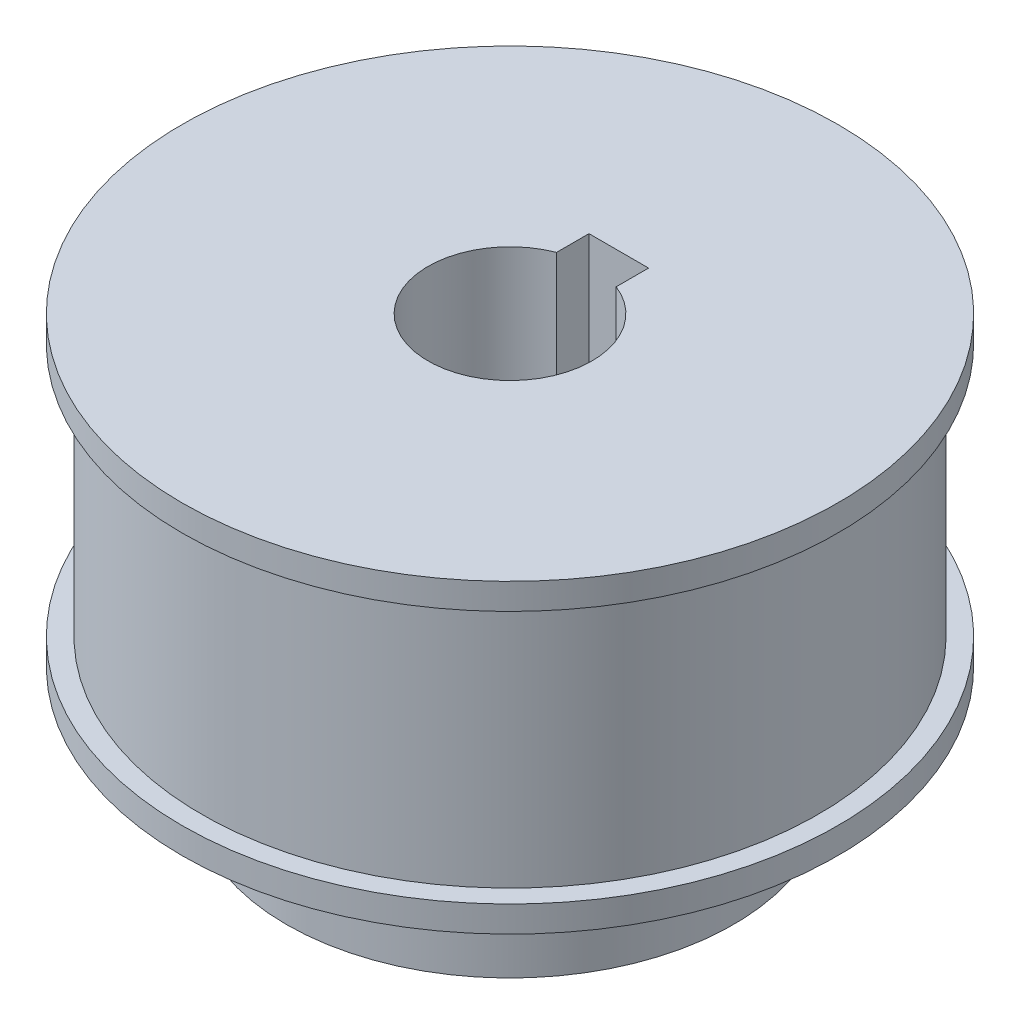
ISO-10303-21;
HEADER;
FILE_DESCRIPTION(('STEP AP214'),'2;1');
FILE_NAME('part.step','',(''),(''),'','','');
FILE_SCHEMA(('AUTOMOTIVE_DESIGN { 1 0 10303 214 1 1 1 1 }'));
ENDSEC;
DATA;
#1=APPLICATION_CONTEXT('core data for automotive mechanical design processes');
#2=APPLICATION_PROTOCOL_DEFINITION('international standard','automotive_design',2000,#1);
#3=PRODUCT_CONTEXT('',#1,'mechanical');
#4=PRODUCT('Part','Part','',(#3));
#5=PRODUCT_RELATED_PRODUCT_CATEGORY('part','',(#4));
#6=PRODUCT_DEFINITION_FORMATION('','',#4);
#7=PRODUCT_DEFINITION_CONTEXT('part definition',#1,'design');
#8=PRODUCT_DEFINITION('design','',#6,#7);
#9=PRODUCT_DEFINITION_SHAPE('','',#8);
#10=(LENGTH_UNIT() NAMED_UNIT(*) SI_UNIT(.MILLI.,.METRE.));
#11=(NAMED_UNIT(*) PLANE_ANGLE_UNIT() SI_UNIT($,.RADIAN.));
#12=(NAMED_UNIT(*) SI_UNIT($,.STERADIAN.) SOLID_ANGLE_UNIT());
#13=UNCERTAINTY_MEASURE_WITH_UNIT(LENGTH_MEASURE(1.E-05),#10,'distance_accuracy_value','');
#14=(GEOMETRIC_REPRESENTATION_CONTEXT(3) GLOBAL_UNCERTAINTY_ASSIGNED_CONTEXT((#13)) GLOBAL_UNIT_ASSIGNED_CONTEXT((#10,
#11,#12)) REPRESENTATION_CONTEXT('',''));
#15=CARTESIAN_POINT('',(0.,0.,0.));
#16=DIRECTION('',(0.,0.,1.));
#17=DIRECTION('',(1.,0.,0.));
#18=AXIS2_PLACEMENT_3D('',#15,#16,#17);
#19=CARTESIAN_POINT('',(4.,0.,0.));
#20=DIRECTION('',(0.,-1.,0.));
#21=DIRECTION('',(0.,0.,-1.));
#22=AXIS2_PLACEMENT_3D('',#19,#20,#21);
#23=PLANE('',#22);
#24=CARTESIAN_POINT('',(0.,0.,0.));
#25=DIRECTION('',(0.,-1.,0.));
#26=DIRECTION('',(0.,0.,-1.));
#27=AXIS2_PLACEMENT_3D('',#24,#25,#26);
#28=CIRCLE('',#27,15.);
#29=CARTESIAN_POINT('',(0.,0.,-15.));
#30=VERTEX_POINT('',#29);
#31=EDGE_CURVE('E83',#30,#30,#28,.T.);
#32=ORIENTED_EDGE('',*,*,#31,.T.);
#33=EDGE_LOOP('',(#32));
#34=FACE_BOUND('',#33,.T.);
#35=DIRECTION('',(-1.,0.,0.));
#36=VECTOR('',#35,1.);
#37=CARTESIAN_POINT('',(4.,0.,-7.3));
#38=LINE('',#37,#36);
#39=CARTESIAN_POINT('',(2.,0.,-7.3));
#40=VERTEX_POINT('',#39);
#41=CARTESIAN_POINT('',(-2.,0.,-7.3));
#42=VERTEX_POINT('',#41);
#43=EDGE_CURVE('E95',#40,#42,#38,.T.);
#44=ORIENTED_EDGE('',*,*,#43,.T.);
#45=DIRECTION('',(0.,0.,1.));
#46=VECTOR('',#45,1.);
#47=CARTESIAN_POINT('',(-2.,0.,0.));
#48=LINE('',#47,#46);
#49=CARTESIAN_POINT('',(-2.,0.,-5.1234753829798));
#50=VERTEX_POINT('',#49);
#51=EDGE_CURVE('E100',#42,#50,#48,.T.);
#52=ORIENTED_EDGE('',*,*,#51,.T.);
#53=CARTESIAN_POINT('',(0.,0.,0.));
#54=DIRECTION('',(0.,-1.,0.));
#55=DIRECTION('',(0.,0.,-1.));
#56=AXIS2_PLACEMENT_3D('',#53,#54,#55);
#57=CIRCLE('',#56,5.5);
#58=CARTESIAN_POINT('',(2.,0.,-5.1234753829798));
#59=VERTEX_POINT('',#58);
#60=EDGE_CURVE('E94',#59,#50,#57,.T.);
#61=ORIENTED_EDGE('',*,*,#60,.F.);
#62=DIRECTION('',(0.,0.,1.));
#63=VECTOR('',#62,1.);
#64=CARTESIAN_POINT('',(2.,0.,0.));
#65=LINE('',#64,#63);
#66=EDGE_CURVE('E52',#40,#59,#65,.T.);
#67=ORIENTED_EDGE('',*,*,#66,.F.);
#68=EDGE_LOOP('',(#44,#52,#61,#67));
#69=FACE_BOUND('',#68,.T.);
#70=ADVANCED_FACE('F38',(#34,#69),#23,.T.);
#71=CARTESIAN_POINT('',(22.,28.,0.));
#72=DIRECTION('',(0.,1.,0.));
#73=DIRECTION('',(0.,0.,1.));
#74=AXIS2_PLACEMENT_3D('',#71,#72,#73);
#75=PLANE('',#74);
#76=CARTESIAN_POINT('',(0.,28.,0.));
#77=DIRECTION('',(0.,-1.,0.));
#78=DIRECTION('',(0.,0.,-1.));
#79=AXIS2_PLACEMENT_3D('',#76,#77,#78);
#80=CIRCLE('',#79,22.);
#81=CARTESIAN_POINT('',(0.,28.,-22.));
#82=VERTEX_POINT('',#81);
#83=EDGE_CURVE('E97',#82,#82,#80,.T.);
#84=ORIENTED_EDGE('',*,*,#83,.F.);
#85=EDGE_LOOP('',(#84));
#86=FACE_BOUND('',#85,.T.);
#87=CARTESIAN_POINT('',(0.,28.,0.));
#88=DIRECTION('',(0.,1.,0.));
#89=DIRECTION('',(0.,0.,1.));
#90=AXIS2_PLACEMENT_3D('',#87,#88,#89);
#91=CIRCLE('',#90,5.5);
#92=CARTESIAN_POINT('',(-2.,28.,-5.1234753829798));
#93=VERTEX_POINT('',#92);
#94=CARTESIAN_POINT('',(2.,28.,-5.1234753829798));
#95=VERTEX_POINT('',#94);
#96=EDGE_CURVE('E88',#93,#95,#91,.T.);
#97=ORIENTED_EDGE('',*,*,#96,.F.);
#98=DIRECTION('',(0.,0.,-1.));
#99=VECTOR('',#98,1.);
#100=CARTESIAN_POINT('',(-2.,28.,0.));
#101=LINE('',#100,#99);
#102=CARTESIAN_POINT('',(-2.,28.,-7.3));
#103=VERTEX_POINT('',#102);
#104=EDGE_CURVE('E282',#93,#103,#101,.T.);
#105=ORIENTED_EDGE('',*,*,#104,.T.);
#106=DIRECTION('',(1.,0.,0.));
#107=VECTOR('',#106,1.);
#108=CARTESIAN_POINT('',(0.,28.,-7.3));
#109=LINE('',#108,#107);
#110=CARTESIAN_POINT('',(2.,28.,-7.3));
#111=VERTEX_POINT('',#110);
#112=EDGE_CURVE('E90',#103,#111,#109,.T.);
#113=ORIENTED_EDGE('',*,*,#112,.T.);
#114=DIRECTION('',(0.,0.,-1.));
#115=VECTOR('',#114,1.);
#116=CARTESIAN_POINT('',(2.,28.,0.));
#117=LINE('',#116,#115);
#118=EDGE_CURVE('E77',#95,#111,#117,.T.);
#119=ORIENTED_EDGE('',*,*,#118,.F.);
#120=EDGE_LOOP('',(#97,#105,#113,#119));
#121=FACE_BOUND('',#120,.T.);
#122=ADVANCED_FACE('F86',(#86,#121),#75,.T.);
#123=CARTESIAN_POINT('',(0.,-5.00000000000002,0.));
#124=DIRECTION('',(0.,1.,0.));
#125=DIRECTION('',(0.,0.,1.));
#126=AXIS2_PLACEMENT_3D('',#123,#124,#125);
#127=CYLINDRICAL_SURFACE('',#126,5.5);
#128=DIRECTION('',(0.,1.,0.));
#129=VECTOR('',#128,1.);
#130=CARTESIAN_POINT('',(-2.,-5.00000000000002,-5.1234753829798));
#131=LINE('',#130,#129);
#132=EDGE_CURVE('E11',#93,#50,#131,.F.);
#133=ORIENTED_EDGE('',*,*,#132,.F.);
#134=ORIENTED_EDGE('',*,*,#96,.T.);
#135=DIRECTION('',(0.,1.,0.));
#136=VECTOR('',#135,1.);
#137=CARTESIAN_POINT('',(2.,-5.00000000000002,-5.1234753829798));
#138=LINE('',#137,#136);
#139=EDGE_CURVE('E45',#95,#59,#138,.F.);
#140=ORIENTED_EDGE('',*,*,#139,.T.);
#141=ORIENTED_EDGE('',*,*,#60,.T.);
#142=EDGE_LOOP('',(#133,#134,#140,#141));
#143=FACE_BOUND('',#142,.T.);
#144=ADVANCED_FACE('F93',(#143),#127,.F.);
#145=CARTESIAN_POINT('',(0.,0.,0.));
#146=DIRECTION('',(0.,-1.,0.));
#147=DIRECTION('',(0.,0.,-1.));
#148=AXIS2_PLACEMENT_3D('',#145,#146,#147);
#149=CYLINDRICAL_SURFACE('',#148,15.);
#150=CARTESIAN_POINT('',(0.,4.95,-15.));
#151=CARTESIAN_POINT('',(0.0672891007203543,4.94999705685258,-14.9999993694438));
#152=CARTESIAN_POINT('',(0.134624243596096,4.94432118674519,-14.9995423880637));
#153=CARTESIAN_POINT('',(0.267432174227966,4.92176221280459,-14.9977633353839));
#154=CARTESIAN_POINT('',(0.33290275312361,4.9048663497256,-14.9964402792185));
#155=CARTESIAN_POINT('',(0.460038816008155,4.86035851139508,-14.9930786176967));
#156=CARTESIAN_POINT('',(0.521706404677639,4.83275252623814,-14.991040412379));
#157=CARTESIAN_POINT('',(0.639517540832527,4.76761861911196,-14.9864771457227));
#158=CARTESIAN_POINT('',(0.695662281232538,4.73009284626529,-14.9839521898708));
#159=CARTESIAN_POINT('',(0.800981520437516,4.64608874132847,-14.9786921754651));
#160=CARTESIAN_POINT('',(0.850141193081525,4.59959184630141,-14.975956688463));
#161=CARTESIAN_POINT('',(0.939967680796123,4.49900448163196,-14.9705875232698));
#162=CARTESIAN_POINT('',(0.980634126131958,4.44491368157624,-14.9679538495151));
#163=CARTESIAN_POINT('',(1.0523693929339,4.33058492650224,-14.9630818276391));
#164=CARTESIAN_POINT('',(1.08342527744728,4.27033882949488,-14.9608440141124));
#165=CARTESIAN_POINT('',(1.13497520543789,4.14546644322448,-14.9570218740643));
#166=CARTESIAN_POINT('',(1.15546942232374,4.08084022589693,-14.9554375368137));
#167=CARTESIAN_POINT('',(1.18527149435678,3.94918994518706,-14.9531052553678));
#168=CARTESIAN_POINT('',(1.19460338904055,3.8821713560664,-14.9523555140024));
#169=CARTESIAN_POINT('',(1.20189017441675,3.74751519031609,-14.9517716026433));
#170=CARTESIAN_POINT('',(1.1998452634274,3.67987762449684,-14.9519374166897));
#171=CARTESIAN_POINT('',(1.18445636506824,3.54606805983348,-14.9531642509417));
#172=CARTESIAN_POINT('',(1.17113848317612,3.47989303709295,-14.9542232028355));
#173=CARTESIAN_POINT('',(1.1336222347798,3.3507206521944,-14.9571137455448));
#174=CARTESIAN_POINT('',(1.10942376932552,3.28772331894068,-14.9589453433869));
#175=CARTESIAN_POINT('',(1.05080395723979,3.16661125869635,-14.9631771775933));
#176=CARTESIAN_POINT('',(1.01637087499178,3.10850223560745,-14.9655780660973));
#177=CARTESIAN_POINT('',(0.938267724972068,2.99887866947173,-14.9706773434807));
#178=CARTESIAN_POINT('',(0.894597485014082,2.9473642493811,-14.9733757379054));
#179=CARTESIAN_POINT('',(0.799113129570554,2.85224038797683,-14.9787751755321));
#180=CARTESIAN_POINT('',(0.7472764413159,2.80865360097,-14.9814762048176));
#181=CARTESIAN_POINT('',(0.637009460522138,2.73079735807935,-14.986569319442));
#182=CARTESIAN_POINT('',(0.578579164017653,2.69652790779899,-14.9889614045952));
#183=CARTESIAN_POINT('',(0.456769038505561,2.63828062271137,-14.9931675074541));
#184=CARTESIAN_POINT('',(0.393388740146218,2.61430376523595,-14.9949814702602));
#185=CARTESIAN_POINT('',(0.263484391245863,2.57733801099053,-14.9978262957681));
#186=CARTESIAN_POINT('',(0.196960400856805,2.56434890406879,-14.9988571734474));
#187=CARTESIAN_POINT('',(0.0628534372155328,2.54975570763277,-15.0000177522765));
#188=CARTESIAN_POINT('',(-0.00472610987194925,2.54812032124009,-15.0001499306977));
#189=CARTESIAN_POINT('',(-0.139198438973656,2.55619903972627,-14.9995048293867));
#190=CARTESIAN_POINT('',(-0.206091226879593,2.56591304715636,-14.9987275574634));
#191=CARTESIAN_POINT('',(-0.337202151642211,2.59638887305364,-14.9963525775414));
#192=CARTESIAN_POINT('',(-0.401423675438523,2.61713621133802,-14.9947559449705));
#193=CARTESIAN_POINT('',(-0.525473906573665,2.6690749838152,-14.9909216507345));
#194=CARTESIAN_POINT('',(-0.585302549731882,2.70026657056294,-14.9886839797061));
#195=CARTESIAN_POINT('',(-0.699011291408514,2.77228725783212,-14.9838123793492));
#196=CARTESIAN_POINT('',(-0.752878201550636,2.8131371222896,-14.9811776007826));
#197=CARTESIAN_POINT('',(-0.853001330235448,2.90328475231336,-14.9758107480535));
#198=CARTESIAN_POINT('',(-0.899257426880185,2.9525826531611,-14.9730786723334));
#199=CARTESIAN_POINT('',(-0.982953003347502,3.05836264017617,-14.9678178394568));
#200=CARTESIAN_POINT('',(-1.02037208125379,3.11486089593671,-14.9652895614929));
#201=CARTESIAN_POINT('',(-1.08519160268471,3.23335719203235,-14.9607292445234));
#202=CARTESIAN_POINT('',(-1.11259213949028,3.29535518115369,-14.9586972008976));
#203=CARTESIAN_POINT('',(-1.15656192078193,3.42301840100141,-14.9553620329034));
#204=CARTESIAN_POINT('',(-1.17314371718104,3.48867928563687,-14.9540580640764));
#205=CARTESIAN_POINT('',(-1.19504621125548,3.62186408923241,-14.9523238045272));
#206=CARTESIAN_POINT('',(-1.20036710634437,3.6893879755114,-14.951893498489));
#207=CARTESIAN_POINT('',(-1.19959455280222,3.8241792644683,-14.9519554851438));
#208=CARTESIAN_POINT('',(-1.19353316257195,3.89144685440732,-14.9524451866218));
#209=CARTESIAN_POINT('',(-1.17023487953944,4.02400548111762,-14.9542865079255));
#210=CARTESIAN_POINT('',(-1.1529979690259,4.08929651475622,-14.9556381291172));
#211=CARTESIAN_POINT('',(-1.10784591484578,4.21605119447078,-14.9590503187523));
#212=CARTESIAN_POINT('',(-1.07993127772688,4.27751502194728,-14.9611108535646));
#213=CARTESIAN_POINT('',(-1.01421985060576,4.39488894073033,-14.965708741226));
#214=CARTESIAN_POINT('',(-0.976423233666111,4.4507991292738,-14.9682460857245));
#215=CARTESIAN_POINT('',(-0.891900433865262,4.55564260767561,-14.9735201724507));
#216=CARTESIAN_POINT('',(-0.845150572179066,4.6045567819845,-14.9762574312458));
#217=CARTESIAN_POINT('',(-0.744090092187472,4.69386311077237,-14.9816182295575));
#218=CARTESIAN_POINT('',(-0.689777643659899,4.73425319636566,-14.9842417413439));
#219=CARTESIAN_POINT('',(-0.575036864240477,4.80541449248027,-14.9890838042582));
#220=CARTESIAN_POINT('',(-0.514598012297869,4.83616877165865,-14.9913016397474));
#221=CARTESIAN_POINT('',(-0.389438355842893,4.88705372338789,-14.9950739045471));
#222=CARTESIAN_POINT('',(-0.32472258759087,4.9071966489906,-14.9966290986186));
#223=CARTESIAN_POINT('',(-0.216352037072058,4.93113817847706,-14.9985001170339));
#224=CARTESIAN_POINT('',(-0.173394876677112,4.93820200627376,-14.9990600235622));
#225=CARTESIAN_POINT('',(-0.086964888269531,4.94763386251458,-14.9998101683779));
#226=CARTESIAN_POINT('',(-0.0434920615017642,4.95000190229245,-15.0000004075577));
#227=CARTESIAN_POINT('',(0.,4.95,-15.));
#228=B_SPLINE_CURVE_WITH_KNOTS('',3,(#150,#151,#152,#153,#154,#155,#156,#157,#158,#159,#160,
#161,#162,#163,#164,#165,#166,#167,#168,#169,#170,#171,#172,#173,#174,#175,#176,#177,#178,#179,
#180,#181,#182,#183,#184,#185,#186,#187,#188,#189,#190,#191,#192,#193,#194,#195,#196,#197,#198,
#199,#200,#201,#202,#203,#204,#205,#206,#207,#208,#209,#210,#211,#212,#213,#214,#215,#216,#217,
#218,#219,#220,#221,#222,#223,#224,#225,#226,#227),.UNSPECIFIED.,.T.,.F.,(4,2,2,2,2,2,2,2,2,2,2,
2,2,2,2,2,2,2,2,2,2,2,2,2,2,2,2,2,2,2,2,2,2,2,2,2,2,2,4),(0.,0.201708512546654,
0.403646799378615,0.605472306014581,0.807254122928382,1.00945803099925,1.21167073975718,
1.41415447846014,1.61663489254172,1.818678448603,2.02071848269199,2.22229191686996,
2.42386718423204,2.62567448729818,2.82748555250769,3.02986455775774,3.2322436847186,
3.43464202431565,3.63703649275422,3.83887283233491,4.04070743891062,4.24227780838161,
4.44385112223875,4.64586179522762,4.8478757033885,5.05035153629311,5.25282548393171,
5.45506410139434,5.65729917340559,5.85896550105527,6.06063214831276,6.2622892297599,
6.46394277983446,6.66613720181649,6.8683806422092,7.0709774826502,7.27333986655259,
7.40371373264851,7.53408728407353),.UNSPECIFIED.);
#229=CARTESIAN_POINT('',(0.,4.95,-15.));
#230=VERTEX_POINT('',#229);
#231=EDGE_CURVE('E91',#230,#230,#228,.T.);
#232=ORIENTED_EDGE('',*,*,#231,.F.);
#233=EDGE_LOOP('',(#232));
#234=FACE_BOUND('',#233,.T.);
#235=CARTESIAN_POINT('',(0.,7.5,0.));
#236=DIRECTION('',(0.,-1.,0.));
#237=DIRECTION('',(0.,0.,-1.));
#238=AXIS2_PLACEMENT_3D('',#235,#236,#237);
#239=CIRCLE('',#238,15.);
#240=CARTESIAN_POINT('',(0.,7.5,-15.));
#241=VERTEX_POINT('',#240);
#242=EDGE_CURVE('E121',#241,#241,#239,.T.);
#243=ORIENTED_EDGE('',*,*,#242,.T.);
#244=EDGE_LOOP('',(#243));
#245=FACE_BOUND('',#244,.T.);
#246=ORIENTED_EDGE('',*,*,#31,.F.);
#247=EDGE_LOOP('',(#246));
#248=FACE_BOUND('',#247,.T.);
#249=ADVANCED_FACE('F129',(#234,#245,#248),#149,.T.);
#250=CARTESIAN_POINT('',(15.,7.5,0.));
#251=DIRECTION('',(0.,-1.,0.));
#252=DIRECTION('',(0.,0.,-1.));
#253=AXIS2_PLACEMENT_3D('',#250,#251,#252);
#254=PLANE('',#253);
#255=CARTESIAN_POINT('',(0.,7.5,0.));
#256=DIRECTION('',(0.,-1.,0.));
#257=DIRECTION('',(0.,0.,-1.));
#258=AXIS2_PLACEMENT_3D('',#255,#256,#257);
#259=CIRCLE('',#258,22.);
#260=CARTESIAN_POINT('',(0.,7.5,-22.));
#261=VERTEX_POINT('',#260);
#262=EDGE_CURVE('E118',#261,#261,#259,.T.);
#263=ORIENTED_EDGE('',*,*,#262,.T.);
#264=EDGE_LOOP('',(#263));
#265=FACE_BOUND('',#264,.T.);
#266=ORIENTED_EDGE('',*,*,#242,.F.);
#267=EDGE_LOOP('',(#266));
#268=FACE_BOUND('',#267,.T.);
#269=ADVANCED_FACE('F131',(#265,#268),#254,.T.);
#270=CARTESIAN_POINT('',(0.,0.,0.));
#271=DIRECTION('',(0.,-1.,0.));
#272=DIRECTION('',(0.,0.,-1.));
#273=AXIS2_PLACEMENT_3D('',#270,#271,#272);
#274=CYLINDRICAL_SURFACE('',#273,22.);
#275=CARTESIAN_POINT('',(0.,9.24999999999999,0.));
#276=DIRECTION('',(0.,-1.,0.));
#277=DIRECTION('',(0.,0.,-1.));
#278=AXIS2_PLACEMENT_3D('',#275,#276,#277);
#279=CIRCLE('',#278,22.);
#280=CARTESIAN_POINT('',(0.,9.24999999999999,-22.));
#281=VERTEX_POINT('',#280);
#282=EDGE_CURVE('E115',#281,#281,#279,.T.);
#283=ORIENTED_EDGE('',*,*,#282,.T.);
#284=EDGE_LOOP('',(#283));
#285=FACE_BOUND('',#284,.T.);
#286=ORIENTED_EDGE('',*,*,#262,.F.);
#287=EDGE_LOOP('',(#286));
#288=FACE_BOUND('',#287,.T.);
#289=ADVANCED_FACE('F137',(#285,#288),#274,.T.);
#290=CARTESIAN_POINT('',(22.,9.24999999999999,0.));
#291=DIRECTION('',(0.,1.,0.));
#292=DIRECTION('',(0.,0.,1.));
#293=AXIS2_PLACEMENT_3D('',#290,#291,#292);
#294=PLANE('',#293);
#295=CARTESIAN_POINT('',(0.,9.24999999999999,0.));
#296=DIRECTION('',(0.,-1.,0.));
#297=DIRECTION('',(0.,0.,-1.));
#298=AXIS2_PLACEMENT_3D('',#295,#296,#297);
#299=CIRCLE('',#298,20.69);
#300=CARTESIAN_POINT('',(0.,9.24999999999999,-20.69));
#301=VERTEX_POINT('',#300);
#302=EDGE_CURVE('E112',#301,#301,#299,.T.);
#303=ORIENTED_EDGE('',*,*,#302,.T.);
#304=EDGE_LOOP('',(#303));
#305=FACE_BOUND('',#304,.T.);
#306=ORIENTED_EDGE('',*,*,#282,.F.);
#307=EDGE_LOOP('',(#306));
#308=FACE_BOUND('',#307,.T.);
#309=ADVANCED_FACE('F167',(#305,#308),#294,.T.);
#310=CARTESIAN_POINT('',(0.,0.,0.));
#311=DIRECTION('',(0.,-1.,0.));
#312=DIRECTION('',(0.,0.,-1.));
#313=AXIS2_PLACEMENT_3D('',#310,#311,#312);
#314=CYLINDRICAL_SURFACE('',#313,20.69);
#315=CARTESIAN_POINT('',(0.,26.25,0.));
#316=DIRECTION('',(0.,-1.,0.));
#317=DIRECTION('',(0.,0.,-1.));
#318=AXIS2_PLACEMENT_3D('',#315,#316,#317);
#319=CIRCLE('',#318,20.69);
#320=CARTESIAN_POINT('',(0.,26.25,-20.69));
#321=VERTEX_POINT('',#320);
#322=EDGE_CURVE('E109',#321,#321,#319,.T.);
#323=ORIENTED_EDGE('',*,*,#322,.T.);
#324=EDGE_LOOP('',(#323));
#325=FACE_BOUND('',#324,.T.);
#326=ORIENTED_EDGE('',*,*,#302,.F.);
#327=EDGE_LOOP('',(#326));
#328=FACE_BOUND('',#327,.T.);
#329=ADVANCED_FACE('F163',(#325,#328),#314,.T.);
#330=CARTESIAN_POINT('',(20.69,26.25,0.));
#331=DIRECTION('',(0.,-1.,0.));
#332=DIRECTION('',(0.,0.,-1.));
#333=AXIS2_PLACEMENT_3D('',#330,#331,#332);
#334=PLANE('',#333);
#335=CARTESIAN_POINT('',(0.,26.25,0.));
#336=DIRECTION('',(0.,-1.,0.));
#337=DIRECTION('',(0.,0.,-1.));
#338=AXIS2_PLACEMENT_3D('',#335,#336,#337);
#339=CIRCLE('',#338,22.);
#340=CARTESIAN_POINT('',(0.,26.25,-22.));
#341=VERTEX_POINT('',#340);
#342=EDGE_CURVE('E106',#341,#341,#339,.T.);
#343=ORIENTED_EDGE('',*,*,#342,.T.);
#344=EDGE_LOOP('',(#343));
#345=FACE_BOUND('',#344,.T.);
#346=ORIENTED_EDGE('',*,*,#322,.F.);
#347=EDGE_LOOP('',(#346));
#348=FACE_BOUND('',#347,.T.);
#349=ADVANCED_FACE('F159',(#345,#348),#334,.T.);
#350=CARTESIAN_POINT('',(0.,0.,0.));
#351=DIRECTION('',(0.,-1.,0.));
#352=DIRECTION('',(0.,0.,-1.));
#353=AXIS2_PLACEMENT_3D('',#350,#351,#352);
#354=CYLINDRICAL_SURFACE('',#353,22.);
#355=ORIENTED_EDGE('',*,*,#83,.T.);
#356=EDGE_LOOP('',(#355));
#357=FACE_BOUND('',#356,.T.);
#358=ORIENTED_EDGE('',*,*,#342,.F.);
#359=EDGE_LOOP('',(#358));
#360=FACE_BOUND('',#359,.T.);
#361=ADVANCED_FACE('F155',(#357,#360),#354,.T.);
#362=CARTESIAN_POINT('',(-2.,-5.00000000000002,0.));
#363=DIRECTION('',(1.,0.,0.));
#364=DIRECTION('',(0.,0.,-1.));
#365=AXIS2_PLACEMENT_3D('',#362,#363,#364);
#366=PLANE('',#365);
#367=DIRECTION('',(0.,1.,0.));
#368=VECTOR('',#367,1.);
#369=CARTESIAN_POINT('',(-2.,-5.00000000000002,-7.3));
#370=LINE('',#369,#368);
#371=EDGE_CURVE('E285',#42,#103,#370,.T.);
#372=ORIENTED_EDGE('',*,*,#371,.T.);
#373=ORIENTED_EDGE('',*,*,#104,.F.);
#374=ORIENTED_EDGE('',*,*,#132,.T.);
#375=ORIENTED_EDGE('',*,*,#51,.F.);
#376=EDGE_LOOP('',(#372,#373,#374,#375));
#377=FACE_BOUND('',#376,.T.);
#378=ADVANCED_FACE('F158',(#377),#366,.T.);
#379=CARTESIAN_POINT('',(0.,-5.00000000000002,-7.3));
#380=DIRECTION('',(0.,0.,1.));
#381=DIRECTION('',(1.,0.,0.));
#382=AXIS2_PLACEMENT_3D('',#379,#380,#381);
#383=PLANE('',#382);
#384=CARTESIAN_POINT('',(0.,3.75,-7.3));
#385=DIRECTION('',(0.,0.,1.));
#386=DIRECTION('',(1.,0.,0.));
#387=AXIS2_PLACEMENT_3D('',#384,#385,#386);
#388=CIRCLE('',#387,1.2);
#389=CARTESIAN_POINT('',(1.2,3.75,-7.3));
#390=VERTEX_POINT('',#389);
#391=EDGE_CURVE('E279',#390,#390,#388,.T.);
#392=ORIENTED_EDGE('',*,*,#391,.F.);
#393=EDGE_LOOP('',(#392));
#394=FACE_BOUND('',#393,.T.);
#395=DIRECTION('',(0.,1.,0.));
#396=VECTOR('',#395,1.);
#397=CARTESIAN_POINT('',(2.,-5.00000000000002,-7.3));
#398=LINE('',#397,#396);
#399=EDGE_CURVE('E284',#40,#111,#398,.T.);
#400=ORIENTED_EDGE('',*,*,#399,.T.);
#401=ORIENTED_EDGE('',*,*,#112,.F.);
#402=ORIENTED_EDGE('',*,*,#371,.F.);
#403=ORIENTED_EDGE('',*,*,#43,.F.);
#404=EDGE_LOOP('',(#400,#401,#402,#403));
#405=FACE_BOUND('',#404,.T.);
#406=ADVANCED_FACE('F206',(#394,#405),#383,.T.);
#407=CARTESIAN_POINT('',(2.,-5.00000000000002,0.));
#408=DIRECTION('',(1.,0.,0.));
#409=DIRECTION('',(0.,0.,-1.));
#410=AXIS2_PLACEMENT_3D('',#407,#408,#409);
#411=PLANE('',#410);
#412=ORIENTED_EDGE('',*,*,#66,.T.);
#413=ORIENTED_EDGE('',*,*,#139,.F.);
#414=ORIENTED_EDGE('',*,*,#118,.T.);
#415=ORIENTED_EDGE('',*,*,#399,.F.);
#416=EDGE_LOOP('',(#412,#413,#414,#415));
#417=FACE_BOUND('',#416,.T.);
#418=ADVANCED_FACE('F76',(#417),#411,.F.);
#419=CARTESIAN_POINT('',(0.,3.75,-87.3));
#420=DIRECTION('',(0.,0.,1.));
#421=DIRECTION('',(1.,0.,0.));
#422=AXIS2_PLACEMENT_3D('',#419,#420,#421);
#423=CYLINDRICAL_SURFACE('',#422,1.2);
#424=ORIENTED_EDGE('',*,*,#231,.T.);
#425=EDGE_LOOP('',(#424));
#426=FACE_BOUND('',#425,.T.);
#427=ORIENTED_EDGE('',*,*,#391,.T.);
#428=EDGE_LOOP('',(#427));
#429=FACE_BOUND('',#428,.T.);
#430=ADVANCED_FACE('F222',(#426,#429),#423,.F.);
#431=CLOSED_SHELL('',(#70,#122,#144,#249,#269,#289,#309,#329,#349,#361,#378,#406,#418,#430));
#432=MANIFOLD_SOLID_BREP('B2',#431);
#433=ADVANCED_BREP_SHAPE_REPRESENTATION('',(#18,#432),#14);
#434=SHAPE_DEFINITION_REPRESENTATION(#9,#433);
ENDSEC;
END-ISO-10303-21;
